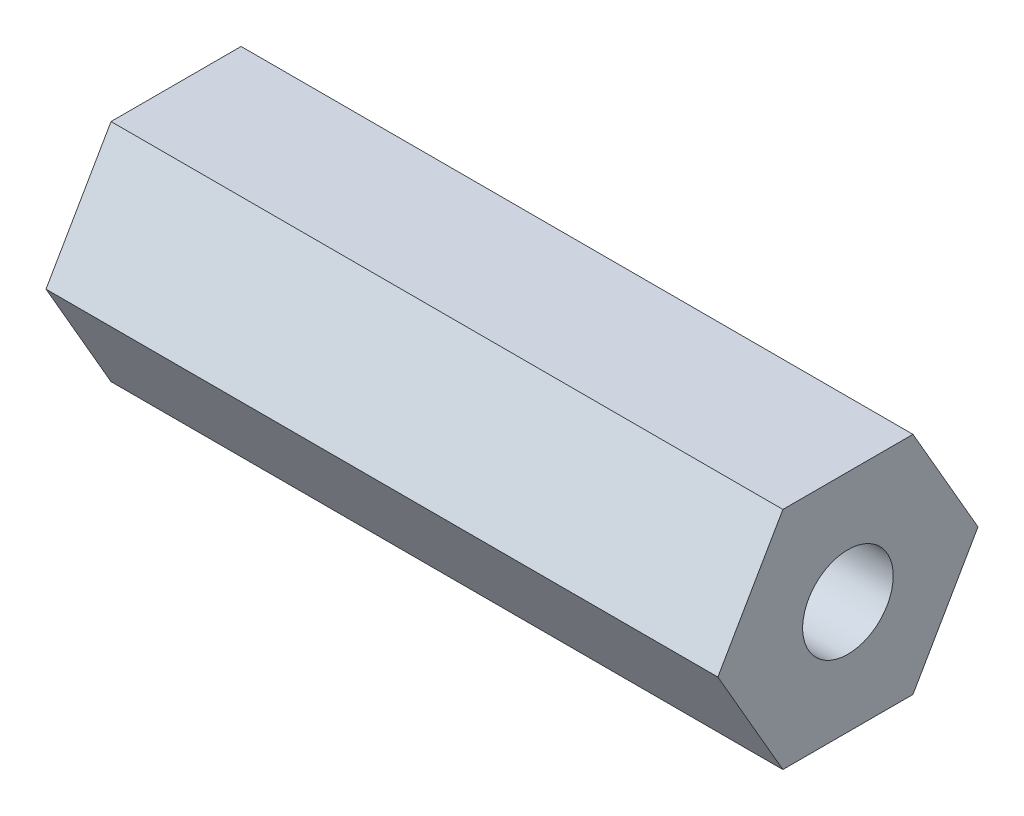
ISO-10303-21;
HEADER;
FILE_DESCRIPTION(('STEP AP214'),'2;1');
FILE_NAME('part.step','',(''),(''),'','','');
FILE_SCHEMA(('AUTOMOTIVE_DESIGN { 1 0 10303 214 1 1 1 1 }'));
ENDSEC;
DATA;
#1=APPLICATION_CONTEXT('core data for automotive mechanical design processes');
#2=APPLICATION_PROTOCOL_DEFINITION('international standard','automotive_design',2000,#1);
#3=PRODUCT_CONTEXT('',#1,'mechanical');
#4=PRODUCT('Part','Part','',(#3));
#5=PRODUCT_RELATED_PRODUCT_CATEGORY('part','',(#4));
#6=PRODUCT_DEFINITION_FORMATION('','',#4);
#7=PRODUCT_DEFINITION_CONTEXT('part definition',#1,'design');
#8=PRODUCT_DEFINITION('design','',#6,#7);
#9=PRODUCT_DEFINITION_SHAPE('','',#8);
#10=(LENGTH_UNIT() NAMED_UNIT(*) SI_UNIT(.MILLI.,.METRE.));
#11=(NAMED_UNIT(*) PLANE_ANGLE_UNIT() SI_UNIT($,.RADIAN.));
#12=(NAMED_UNIT(*) SI_UNIT($,.STERADIAN.) SOLID_ANGLE_UNIT());
#13=UNCERTAINTY_MEASURE_WITH_UNIT(LENGTH_MEASURE(1.E-05),#10,'distance_accuracy_value','');
#14=(GEOMETRIC_REPRESENTATION_CONTEXT(3) GLOBAL_UNCERTAINTY_ASSIGNED_CONTEXT((#13)) GLOBAL_UNIT_ASSIGNED_CONTEXT((#10,
#11,#12)) REPRESENTATION_CONTEXT('',''));
#15=CARTESIAN_POINT('',(0.,0.,0.));
#16=DIRECTION('',(0.,0.,1.));
#17=DIRECTION('',(1.,0.,0.));
#18=AXIS2_PLACEMENT_3D('',#15,#16,#17);
#19=CARTESIAN_POINT('',(18.937499939,-6.34999999999996,-3.6661742093542));
#20=DIRECTION('',(0.,0.499999999999995,0.866025403784441));
#21=DIRECTION('',(0.,-0.866025403784442,0.499999999999995));
#22=AXIS2_PLACEMENT_3D('',#19,#20,#21);
#23=PLANE('',#22);
#24=DIRECTION('',(0.,0.866025403784441,-0.499999999999995));
#25=VECTOR('',#24,1.);
#26=CARTESIAN_POINT('',(-18.937499939,-6.34999999999996,-3.6661742093542));
#27=LINE('',#26,#25);
#28=CARTESIAN_POINT('',(-18.937499939,-6.34999999999996,-3.6661742093542));
#29=VERTEX_POINT('',#28);
#30=CARTESIAN_POINT('',(-18.937499939,0.,-7.33234841870825));
#31=VERTEX_POINT('',#30);
#32=EDGE_CURVE('E127',#29,#31,#27,.T.);
#33=ORIENTED_EDGE('',*,*,#32,.T.);
#34=DIRECTION('',(-1.,0.,0.));
#35=VECTOR('',#34,1.);
#36=CARTESIAN_POINT('',(18.937499939,0.,-7.33234841870825));
#37=LINE('',#36,#35);
#38=CARTESIAN_POINT('',(18.937499939,0.,-7.33234841870825));
#39=VERTEX_POINT('',#38);
#40=EDGE_CURVE('E11',#39,#31,#37,.T.);
#41=ORIENTED_EDGE('',*,*,#40,.F.);
#42=DIRECTION('',(0.,0.866025403784441,-0.499999999999995));
#43=VECTOR('',#42,1.);
#44=CARTESIAN_POINT('',(18.937499939,-6.34999999999996,-3.6661742093542));
#45=LINE('',#44,#43);
#46=CARTESIAN_POINT('',(18.937499939,-6.34999999999996,-3.6661742093542));
#47=VERTEX_POINT('',#46);
#48=EDGE_CURVE('E138',#47,#39,#45,.T.);
#49=ORIENTED_EDGE('',*,*,#48,.F.);
#50=DIRECTION('',(-1.,0.,0.));
#51=VECTOR('',#50,1.);
#52=CARTESIAN_POINT('',(18.937499939,-6.34999999999996,-3.6661742093542));
#53=LINE('',#52,#51);
#54=EDGE_CURVE('E123',#47,#29,#53,.T.);
#55=ORIENTED_EDGE('',*,*,#54,.T.);
#56=EDGE_LOOP('',(#33,#41,#49,#55));
#57=FACE_BOUND('',#56,.T.);
#58=ADVANCED_FACE('F43',(#57),#23,.F.);
#59=CARTESIAN_POINT('',(18.937499939,0.,-7.33234841870825));
#60=DIRECTION('',(0.,-0.500000000000001,0.866025403784438));
#61=DIRECTION('',(0.,-0.866025403784438,-0.500000000000001));
#62=AXIS2_PLACEMENT_3D('',#59,#60,#61);
#63=PLANE('',#62);
#64=DIRECTION('',(0.,0.866025403784438,0.500000000000001));
#65=VECTOR('',#64,1.);
#66=CARTESIAN_POINT('',(-18.937499939,0.,-7.33234841870825));
#67=LINE('',#66,#65);
#68=CARTESIAN_POINT('',(-18.937499939,6.35000000000001,-3.66617420935411));
#69=VERTEX_POINT('',#68);
#70=EDGE_CURVE('E130',#31,#69,#67,.T.);
#71=ORIENTED_EDGE('',*,*,#70,.T.);
#72=DIRECTION('',(-1.,0.,0.));
#73=VECTOR('',#72,1.);
#74=CARTESIAN_POINT('',(18.937499939,6.35000000000001,-3.66617420935411));
#75=LINE('',#74,#73);
#76=CARTESIAN_POINT('',(18.937499939,6.35000000000001,-3.66617420935411));
#77=VERTEX_POINT('',#76);
#78=EDGE_CURVE('E51',#77,#69,#75,.T.);
#79=ORIENTED_EDGE('',*,*,#78,.F.);
#80=DIRECTION('',(0.,0.866025403784438,0.500000000000001));
#81=VECTOR('',#80,1.);
#82=CARTESIAN_POINT('',(18.937499939,0.,-7.33234841870825));
#83=LINE('',#82,#81);
#84=EDGE_CURVE('E96',#39,#77,#83,.T.);
#85=ORIENTED_EDGE('',*,*,#84,.F.);
#86=ORIENTED_EDGE('',*,*,#40,.T.);
#87=EDGE_LOOP('',(#71,#79,#85,#86));
#88=FACE_BOUND('',#87,.T.);
#89=ADVANCED_FACE('F163',(#88),#63,.F.);
#90=CARTESIAN_POINT('',(18.937499939,6.35000000000001,-3.66617420935411));
#91=DIRECTION('',(0.,-1.,0.));
#92=DIRECTION('',(0.,0.,-1.));
#93=AXIS2_PLACEMENT_3D('',#90,#91,#92);
#94=PLANE('',#93);
#95=DIRECTION('',(0.,0.,1.));
#96=VECTOR('',#95,1.);
#97=CARTESIAN_POINT('',(-18.937499939,6.35000000000001,-3.66617420935411));
#98=LINE('',#97,#96);
#99=CARTESIAN_POINT('',(-18.937499939,6.34999999999999,3.66617420935416));
#100=VERTEX_POINT('',#99);
#101=EDGE_CURVE('E133',#69,#100,#98,.T.);
#102=ORIENTED_EDGE('',*,*,#101,.T.);
#103=DIRECTION('',(-1.,0.,0.));
#104=VECTOR('',#103,1.);
#105=CARTESIAN_POINT('',(18.937499939,6.34999999999999,3.66617420935416));
#106=LINE('',#105,#104);
#107=CARTESIAN_POINT('',(18.937499939,6.34999999999999,3.66617420935416));
#108=VERTEX_POINT('',#107);
#109=EDGE_CURVE('E118',#108,#100,#106,.T.);
#110=ORIENTED_EDGE('',*,*,#109,.F.);
#111=DIRECTION('',(0.,0.,1.));
#112=VECTOR('',#111,1.);
#113=CARTESIAN_POINT('',(18.937499939,6.35000000000001,-3.66617420935411));
#114=LINE('',#113,#112);
#115=EDGE_CURVE('E109',#77,#108,#114,.T.);
#116=ORIENTED_EDGE('',*,*,#115,.F.);
#117=ORIENTED_EDGE('',*,*,#78,.T.);
#118=EDGE_LOOP('',(#102,#110,#116,#117));
#119=FACE_BOUND('',#118,.T.);
#120=ADVANCED_FACE('F144',(#119),#94,.F.);
#121=CARTESIAN_POINT('',(18.937499939,6.34999999999999,3.66617420935416));
#122=DIRECTION('',(0.,-0.499999999999995,-0.866025403784442));
#123=DIRECTION('',(0.,0.866025403784442,-0.499999999999995));
#124=AXIS2_PLACEMENT_3D('',#121,#122,#123);
#125=PLANE('',#124);
#126=DIRECTION('',(0.,-0.866025403784441,0.499999999999995));
#127=VECTOR('',#126,1.);
#128=CARTESIAN_POINT('',(-18.937499939,6.34999999999999,3.66617420935416));
#129=LINE('',#128,#127);
#130=CARTESIAN_POINT('',(-18.937499939,0.,7.33234841870825));
#131=VERTEX_POINT('',#130);
#132=EDGE_CURVE('E117',#100,#131,#129,.T.);
#133=ORIENTED_EDGE('',*,*,#132,.T.);
#134=DIRECTION('',(-1.,0.,0.));
#135=VECTOR('',#134,1.);
#136=CARTESIAN_POINT('',(18.937499939,0.,7.33234841870825));
#137=LINE('',#136,#135);
#138=CARTESIAN_POINT('',(18.937499939,0.,7.33234841870825));
#139=VERTEX_POINT('',#138);
#140=EDGE_CURVE('E114',#139,#131,#137,.T.);
#141=ORIENTED_EDGE('',*,*,#140,.F.);
#142=DIRECTION('',(0.,-0.866025403784441,0.499999999999995));
#143=VECTOR('',#142,1.);
#144=CARTESIAN_POINT('',(18.937499939,6.34999999999999,3.66617420935416));
#145=LINE('',#144,#143);
#146=EDGE_CURVE('E103',#108,#139,#145,.T.);
#147=ORIENTED_EDGE('',*,*,#146,.F.);
#148=ORIENTED_EDGE('',*,*,#109,.T.);
#149=EDGE_LOOP('',(#133,#141,#147,#148));
#150=FACE_BOUND('',#149,.T.);
#151=ADVANCED_FACE('F115',(#150),#125,.F.);
#152=CARTESIAN_POINT('',(18.937499939,0.,7.33234841870825));
#153=DIRECTION('',(0.,0.500000000000007,-0.866025403784434));
#154=DIRECTION('',(0.,0.866025403784435,0.500000000000007));
#155=AXIS2_PLACEMENT_3D('',#152,#153,#154);
#156=PLANE('',#155);
#157=DIRECTION('',(0.,-0.866025403784435,-0.500000000000007));
#158=VECTOR('',#157,1.);
#159=CARTESIAN_POINT('',(-18.937499939,0.,7.33234841870825));
#160=LINE('',#159,#158);
#161=CARTESIAN_POINT('',(-18.937499939,-6.35000000000004,3.66617420935407));
#162=VERTEX_POINT('',#161);
#163=EDGE_CURVE('E82',#131,#162,#160,.T.);
#164=ORIENTED_EDGE('',*,*,#163,.T.);
#165=DIRECTION('',(-1.,0.,0.));
#166=VECTOR('',#165,1.);
#167=CARTESIAN_POINT('',(18.937499939,-6.35000000000004,3.66617420935407));
#168=LINE('',#167,#166);
#169=CARTESIAN_POINT('',(18.937499939,-6.35000000000004,3.66617420935407));
#170=VERTEX_POINT('',#169);
#171=EDGE_CURVE('E119',#170,#162,#168,.T.);
#172=ORIENTED_EDGE('',*,*,#171,.F.);
#173=DIRECTION('',(0.,-0.866025403784435,-0.500000000000007));
#174=VECTOR('',#173,1.);
#175=CARTESIAN_POINT('',(18.937499939,0.,7.33234841870825));
#176=LINE('',#175,#174);
#177=EDGE_CURVE('E107',#139,#170,#176,.T.);
#178=ORIENTED_EDGE('',*,*,#177,.F.);
#179=ORIENTED_EDGE('',*,*,#140,.T.);
#180=EDGE_LOOP('',(#164,#172,#178,#179));
#181=FACE_BOUND('',#180,.T.);
#182=ADVANCED_FACE('F121',(#181),#156,.F.);
#183=CARTESIAN_POINT('',(18.937499939,-6.35000000000004,3.66617420935407));
#184=DIRECTION('',(0.,1.,0.));
#185=DIRECTION('',(0.,0.,1.));
#186=AXIS2_PLACEMENT_3D('',#183,#184,#185);
#187=PLANE('',#186);
#188=DIRECTION('',(0.,0.,-1.));
#189=VECTOR('',#188,1.);
#190=CARTESIAN_POINT('',(-18.937499939,-6.35000000000004,3.66617420935407));
#191=LINE('',#190,#189);
#192=EDGE_CURVE('E88',#162,#29,#191,.T.);
#193=ORIENTED_EDGE('',*,*,#192,.T.);
#194=ORIENTED_EDGE('',*,*,#54,.F.);
#195=DIRECTION('',(0.,0.,-1.));
#196=VECTOR('',#195,1.);
#197=CARTESIAN_POINT('',(18.937499939,-6.35000000000004,3.66617420935407));
#198=LINE('',#197,#196);
#199=EDGE_CURVE('E59',#170,#47,#198,.T.);
#200=ORIENTED_EDGE('',*,*,#199,.F.);
#201=ORIENTED_EDGE('',*,*,#171,.T.);
#202=EDGE_LOOP('',(#193,#194,#200,#201));
#203=FACE_BOUND('',#202,.T.);
#204=ADVANCED_FACE('F151',(#203),#187,.F.);
#205=CARTESIAN_POINT('',(18.937499939,0.,0.));
#206=DIRECTION('',(1.,0.,0.));
#207=DIRECTION('',(0.,0.,-1.));
#208=AXIS2_PLACEMENT_3D('',#205,#206,#207);
#209=PLANE('',#208);
#210=CARTESIAN_POINT('',(18.937499939,0.,0.));
#211=DIRECTION('',(1.,0.,0.));
#212=DIRECTION('',(0.,0.,-1.));
#213=AXIS2_PLACEMENT_3D('',#210,#211,#212);
#214=CIRCLE('',#213,2.55269999999999);
#215=CARTESIAN_POINT('',(18.937499939,0.,-2.55269999999999));
#216=VERTEX_POINT('',#215);
#217=EDGE_CURVE('E255',#216,#216,#214,.T.);
#218=ORIENTED_EDGE('',*,*,#217,.F.);
#219=EDGE_LOOP('',(#218));
#220=FACE_BOUND('',#219,.T.);
#221=ORIENTED_EDGE('',*,*,#48,.T.);
#222=ORIENTED_EDGE('',*,*,#84,.T.);
#223=ORIENTED_EDGE('',*,*,#115,.T.);
#224=ORIENTED_EDGE('',*,*,#146,.T.);
#225=ORIENTED_EDGE('',*,*,#177,.T.);
#226=ORIENTED_EDGE('',*,*,#199,.T.);
#227=EDGE_LOOP('',(#221,#222,#223,#224,#225,#226));
#228=FACE_BOUND('',#227,.T.);
#229=ADVANCED_FACE('F105',(#220,#228),#209,.T.);
#230=CARTESIAN_POINT('',(-18.937499939,0.,0.));
#231=DIRECTION('',(1.,0.,0.));
#232=DIRECTION('',(0.,0.,-1.));
#233=AXIS2_PLACEMENT_3D('',#230,#231,#232);
#234=PLANE('',#233);
#235=CARTESIAN_POINT('',(-18.937499939,0.,0.));
#236=DIRECTION('',(1.,0.,0.));
#237=DIRECTION('',(0.,0.,-1.));
#238=AXIS2_PLACEMENT_3D('',#235,#236,#237);
#239=CIRCLE('',#238,2.55269999999999);
#240=CARTESIAN_POINT('',(-18.937499939,0.,-2.55269999999999));
#241=VERTEX_POINT('',#240);
#242=EDGE_CURVE('E131',#241,#241,#239,.T.);
#243=ORIENTED_EDGE('',*,*,#242,.T.);
#244=EDGE_LOOP('',(#243));
#245=FACE_BOUND('',#244,.T.);
#246=ORIENTED_EDGE('',*,*,#32,.F.);
#247=ORIENTED_EDGE('',*,*,#192,.F.);
#248=ORIENTED_EDGE('',*,*,#163,.F.);
#249=ORIENTED_EDGE('',*,*,#132,.F.);
#250=ORIENTED_EDGE('',*,*,#101,.F.);
#251=ORIENTED_EDGE('',*,*,#70,.F.);
#252=EDGE_LOOP('',(#246,#247,#248,#249,#250,#251));
#253=FACE_BOUND('',#252,.T.);
#254=ADVANCED_FACE('F147',(#245,#253),#234,.F.);
#255=CARTESIAN_POINT('',(18.937499939,0.,0.));
#256=DIRECTION('',(1.,0.,0.));
#257=DIRECTION('',(0.,0.,-1.));
#258=AXIS2_PLACEMENT_3D('',#255,#256,#257);
#259=CYLINDRICAL_SURFACE('',#258,2.55269999999999);
#260=ORIENTED_EDGE('',*,*,#242,.F.);
#261=EDGE_LOOP('',(#260));
#262=FACE_BOUND('',#261,.T.);
#263=ORIENTED_EDGE('',*,*,#217,.T.);
#264=EDGE_LOOP('',(#263));
#265=FACE_BOUND('',#264,.T.);
#266=ADVANCED_FACE('F205',(#262,#265),#259,.F.);
#267=CLOSED_SHELL('',(#58,#89,#120,#151,#182,#204,#229,#254,#266));
#268=MANIFOLD_SOLID_BREP('B2',#267);
#269=ADVANCED_BREP_SHAPE_REPRESENTATION('',(#18,#268),#14);
#270=SHAPE_DEFINITION_REPRESENTATION(#9,#269);
ENDSEC;
END-ISO-10303-21;
